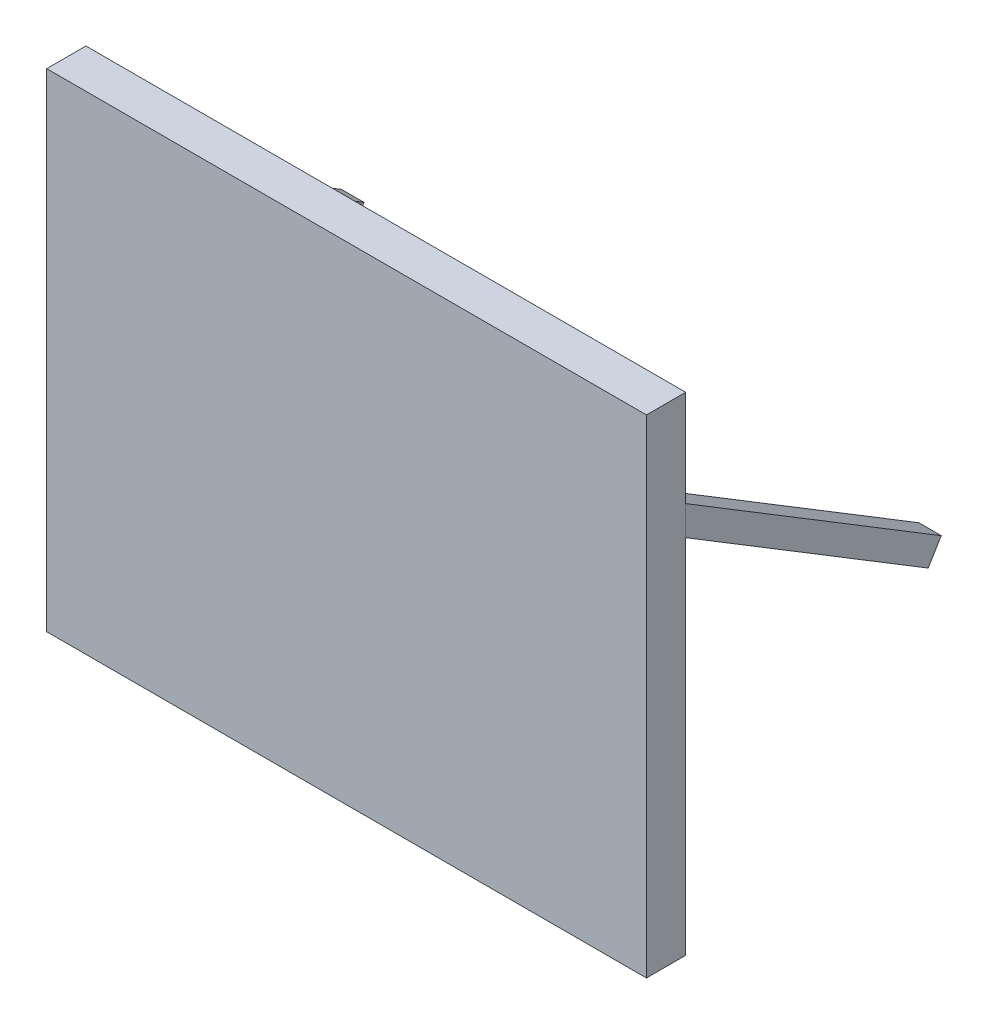
ISO-10303-21;
HEADER;
FILE_DESCRIPTION(('STEP AP214'),'2;1');
FILE_NAME('part.step','',(''),(''),'','','');
FILE_SCHEMA(('AUTOMOTIVE_DESIGN { 1 0 10303 214 1 1 1 1 }'));
ENDSEC;
DATA;
#1=APPLICATION_CONTEXT('core data for automotive mechanical design processes');
#2=APPLICATION_PROTOCOL_DEFINITION('international standard','automotive_design',2000,#1);
#3=PRODUCT_CONTEXT('',#1,'mechanical');
#4=PRODUCT('Part','Part','',(#3));
#5=PRODUCT_RELATED_PRODUCT_CATEGORY('part','',(#4));
#6=PRODUCT_DEFINITION_FORMATION('','',#4);
#7=PRODUCT_DEFINITION_CONTEXT('part definition',#1,'design');
#8=PRODUCT_DEFINITION('design','',#6,#7);
#9=PRODUCT_DEFINITION_SHAPE('','',#8);
#10=(LENGTH_UNIT() NAMED_UNIT(*) SI_UNIT(.MILLI.,.METRE.));
#11=(NAMED_UNIT(*) PLANE_ANGLE_UNIT() SI_UNIT($,.RADIAN.));
#12=(NAMED_UNIT(*) SI_UNIT($,.STERADIAN.) SOLID_ANGLE_UNIT());
#13=UNCERTAINTY_MEASURE_WITH_UNIT(LENGTH_MEASURE(1.E-05),#10,'distance_accuracy_value','');
#14=(GEOMETRIC_REPRESENTATION_CONTEXT(3) GLOBAL_UNCERTAINTY_ASSIGNED_CONTEXT((#13)) GLOBAL_UNIT_ASSIGNED_CONTEXT((#10,
#11,#12)) REPRESENTATION_CONTEXT('',''));
#15=CARTESIAN_POINT('',(0.,0.,0.));
#16=DIRECTION('',(0.,0.,1.));
#17=DIRECTION('',(1.,0.,0.));
#18=AXIS2_PLACEMENT_3D('',#15,#16,#17);
#19=CARTESIAN_POINT('',(314.325,133.566148273431,0.));
#20=DIRECTION('',(0.,0.,1.));
#21=DIRECTION('',(0.,-1.,0.));
#22=AXIS2_PLACEMENT_3D('',#19,#20,#21);
#23=PLANE('',#22);
#24=DIRECTION('',(0.,-1.,0.));
#25=VECTOR('',#24,1.);
#26=CARTESIAN_POINT('',(339.725,133.566148273431,0.));
#27=LINE('',#26,#25);
#28=CARTESIAN_POINT('',(339.725,166.995205225539,0.));
#29=VERTEX_POINT('',#28);
#30=CARTESIAN_POINT('',(339.725,133.566148273431,0.));
#31=VERTEX_POINT('',#30);
#32=EDGE_CURVE('E109',#29,#31,#27,.T.);
#33=ORIENTED_EDGE('',*,*,#32,.F.);
#34=DIRECTION('',(1.,0.,0.));
#35=VECTOR('',#34,1.);
#36=CARTESIAN_POINT('',(314.325,166.995205225539,0.));
#37=LINE('',#36,#35);
#38=CARTESIAN_POINT('',(314.325,166.995205225539,0.));
#39=VERTEX_POINT('',#38);
#40=EDGE_CURVE('E12',#39,#29,#37,.T.);
#41=ORIENTED_EDGE('',*,*,#40,.F.);
#42=DIRECTION('',(0.,-1.,0.));
#43=VECTOR('',#42,1.);
#44=CARTESIAN_POINT('',(314.325,133.566148273431,0.));
#45=LINE('',#44,#43);
#46=CARTESIAN_POINT('',(314.325,133.566148273431,0.));
#47=VERTEX_POINT('',#46);
#48=EDGE_CURVE('E103',#39,#47,#45,.T.);
#49=ORIENTED_EDGE('',*,*,#48,.T.);
#50=DIRECTION('',(1.,0.,0.));
#51=VECTOR('',#50,1.);
#52=CARTESIAN_POINT('',(314.325,133.566148273431,0.));
#53=LINE('',#52,#51);
#54=EDGE_CURVE('E48',#47,#31,#53,.T.);
#55=ORIENTED_EDGE('',*,*,#54,.T.);
#56=EDGE_LOOP('',(#33,#41,#49,#55));
#57=FACE_BOUND('',#56,.T.);
#58=ADVANCED_FACE('F45',(#57),#23,.T.);
#59=CARTESIAN_POINT('',(314.325,166.995205225539,0.));
#60=DIRECTION('',(0.,0.854215947005178,-0.519918374249311));
#61=DIRECTION('',(0.,0.519918374249311,0.854215947005178));
#62=AXIS2_PLACEMENT_3D('',#59,#60,#61);
#63=PLANE('',#62);
#64=DIRECTION('',(0.,0.519918374249311,0.854215947005178));
#65=VECTOR('',#64,1.);
#66=CARTESIAN_POINT('',(339.725,166.995205225539,0.));
#67=LINE('',#66,#65);
#68=CARTESIAN_POINT('',(339.725,-9.2494826660646,-289.566652052512));
#69=VERTEX_POINT('',#68);
#70=EDGE_CURVE('E105',#69,#29,#67,.T.);
#71=ORIENTED_EDGE('',*,*,#70,.F.);
#72=DIRECTION('',(1.,0.,0.));
#73=VECTOR('',#72,1.);
#74=CARTESIAN_POINT('',(314.325,-9.2494826660646,-289.566652052512));
#75=LINE('',#74,#73);
#76=CARTESIAN_POINT('',(314.325,-9.2494826660646,-289.566652052512));
#77=VERTEX_POINT('',#76);
#78=EDGE_CURVE('E54',#77,#69,#75,.T.);
#79=ORIENTED_EDGE('',*,*,#78,.F.);
#80=DIRECTION('',(0.,0.519918374249311,0.854215947005178));
#81=VECTOR('',#80,1.);
#82=CARTESIAN_POINT('',(314.325,166.995205225539,0.));
#83=LINE('',#82,#81);
#84=EDGE_CURVE('E100',#77,#39,#83,.T.);
#85=ORIENTED_EDGE('',*,*,#84,.T.);
#86=ORIENTED_EDGE('',*,*,#40,.T.);
#87=EDGE_LOOP('',(#71,#79,#85,#86));
#88=FACE_BOUND('',#87,.T.);
#89=ADVANCED_FACE('F119',(#88),#63,.T.);
#90=CARTESIAN_POINT('',(314.325,-9.2494826660646,-289.566652052512));
#91=DIRECTION('',(0.,-0.519918374249312,-0.854215947005178));
#92=DIRECTION('',(0.,0.854215947005178,-0.519918374249312));
#93=AXIS2_PLACEMENT_3D('',#90,#91,#92);
#94=PLANE('',#93);
#95=DIRECTION('',(0.,0.854215947005178,-0.519918374249312));
#96=VECTOR('',#95,1.);
#97=CARTESIAN_POINT('',(339.725,-9.2494826660646,-289.566652052512));
#98=LINE('',#97,#96);
#99=CARTESIAN_POINT('',(339.725,-33.642160214336,-274.720053485782));
#100=VERTEX_POINT('',#99);
#101=EDGE_CURVE('E95',#100,#69,#98,.T.);
#102=ORIENTED_EDGE('',*,*,#101,.F.);
#103=DIRECTION('',(1.,0.,0.));
#104=VECTOR('',#103,1.);
#105=CARTESIAN_POINT('',(314.325,-33.642160214336,-274.720053485782));
#106=LINE('',#105,#104);
#107=CARTESIAN_POINT('',(314.325,-33.642160214336,-274.720053485782));
#108=VERTEX_POINT('',#107);
#109=EDGE_CURVE('E90',#108,#100,#106,.T.);
#110=ORIENTED_EDGE('',*,*,#109,.F.);
#111=DIRECTION('',(0.,0.854215947005178,-0.519918374249312));
#112=VECTOR('',#111,1.);
#113=CARTESIAN_POINT('',(314.325,-9.2494826660646,-289.566652052512));
#114=LINE('',#113,#112);
#115=EDGE_CURVE('E93',#108,#77,#114,.T.);
#116=ORIENTED_EDGE('',*,*,#115,.T.);
#117=ORIENTED_EDGE('',*,*,#78,.T.);
#118=EDGE_LOOP('',(#102,#110,#116,#117));
#119=FACE_BOUND('',#118,.T.);
#120=ADVANCED_FACE('F92',(#119),#94,.T.);
#121=CARTESIAN_POINT('',(314.325,-33.642160214336,-274.720053485782));
#122=DIRECTION('',(0.,-0.854215947005178,0.519918374249312));
#123=DIRECTION('',(0.,-0.519918374249312,-0.854215947005178));
#124=AXIS2_PLACEMENT_3D('',#121,#122,#123);
#125=PLANE('',#124);
#126=DIRECTION('',(0.,-0.519918374249312,-0.854215947005178));
#127=VECTOR('',#126,1.);
#128=CARTESIAN_POINT('',(339.725,-33.642160214336,-274.720053485782));
#129=LINE('',#128,#127);
#130=EDGE_CURVE('E112',#31,#100,#129,.T.);
#131=ORIENTED_EDGE('',*,*,#130,.F.);
#132=ORIENTED_EDGE('',*,*,#54,.F.);
#133=DIRECTION('',(0.,-0.519918374249312,-0.854215947005178));
#134=VECTOR('',#133,1.);
#135=CARTESIAN_POINT('',(314.325,-33.642160214336,-274.720053485782));
#136=LINE('',#135,#134);
#137=EDGE_CURVE('E99',#47,#108,#136,.T.);
#138=ORIENTED_EDGE('',*,*,#137,.T.);
#139=ORIENTED_EDGE('',*,*,#109,.T.);
#140=EDGE_LOOP('',(#131,#132,#138,#139));
#141=FACE_BOUND('',#140,.T.);
#142=ADVANCED_FACE('F102',(#141),#125,.T.);
#143=CARTESIAN_POINT('',(314.325,0.,0.));
#144=DIRECTION('',(-1.,0.,0.));
#145=DIRECTION('',(0.,0.,1.));
#146=AXIS2_PLACEMENT_3D('',#143,#144,#145);
#147=PLANE('',#146);
#148=ORIENTED_EDGE('',*,*,#48,.F.);
#149=ORIENTED_EDGE('',*,*,#84,.F.);
#150=ORIENTED_EDGE('',*,*,#115,.F.);
#151=ORIENTED_EDGE('',*,*,#137,.F.);
#152=EDGE_LOOP('',(#148,#149,#150,#151));
#153=FACE_BOUND('',#152,.T.);
#154=ADVANCED_FACE('F98',(#153),#147,.T.);
#155=CARTESIAN_POINT('',(339.725,0.,0.));
#156=DIRECTION('',(-1.,0.,0.));
#157=DIRECTION('',(0.,0.,1.));
#158=AXIS2_PLACEMENT_3D('',#155,#156,#157);
#159=PLANE('',#158);
#160=ORIENTED_EDGE('',*,*,#32,.T.);
#161=ORIENTED_EDGE('',*,*,#130,.T.);
#162=ORIENTED_EDGE('',*,*,#101,.T.);
#163=ORIENTED_EDGE('',*,*,#70,.T.);
#164=EDGE_LOOP('',(#160,#161,#162,#163));
#165=FACE_BOUND('',#164,.T.);
#166=ADVANCED_FACE('F118',(#165),#159,.F.);
#167=CLOSED_SHELL('',(#58,#89,#120,#142,#154,#166));
#168=MANIFOLD_SOLID_BREP('B2',#167);
#169=CARTESIAN_POINT('',(0.,0.,0.));
#170=DIRECTION('',(0.,0.,1.));
#171=DIRECTION('',(1.,0.,0.));
#172=AXIS2_PLACEMENT_3D('',#169,#170,#171);
#173=PLANE('',#172);
#174=DIRECTION('',(-1.,0.,0.));
#175=VECTOR('',#174,1.);
#176=CARTESIAN_POINT('',(-314.325,133.566148273431,0.));
#177=LINE('',#176,#175);
#178=CARTESIAN_POINT('',(-314.325,133.566148273431,0.));
#179=VERTEX_POINT('',#178);
#180=CARTESIAN_POINT('',(-339.725,133.566148273431,0.));
#181=VERTEX_POINT('',#180);
#182=EDGE_CURVE('E260',#179,#181,#177,.T.);
#183=ORIENTED_EDGE('',*,*,#182,.F.);
#184=DIRECTION('',(0.,-1.,0.));
#185=VECTOR('',#184,1.);
#186=CARTESIAN_POINT('',(-314.325,-276.225,0.));
#187=LINE('',#186,#185);
#188=CARTESIAN_POINT('',(-314.325,166.995205225539,0.));
#189=VERTEX_POINT('',#188);
#190=EDGE_CURVE('E247',#189,#179,#187,.T.);
#191=ORIENTED_EDGE('',*,*,#190,.F.);
#192=DIRECTION('',(-1.,0.,0.));
#193=VECTOR('',#192,1.);
#194=CARTESIAN_POINT('',(-314.325,166.995205225539,0.));
#195=LINE('',#194,#193);
#196=CARTESIAN_POINT('',(-339.725,166.995205225539,0.));
#197=VERTEX_POINT('',#196);
#198=EDGE_CURVE('E254',#189,#197,#195,.T.);
#199=ORIENTED_EDGE('',*,*,#198,.T.);
#200=DIRECTION('',(0.,-1.,0.));
#201=VECTOR('',#200,1.);
#202=CARTESIAN_POINT('',(-339.725,-276.225,0.));
#203=LINE('',#202,#201);
#204=CARTESIAN_POINT('',(-339.725,276.225,0.));
#205=VERTEX_POINT('',#204);
#206=EDGE_CURVE('E286',#205,#197,#203,.T.);
#207=ORIENTED_EDGE('',*,*,#206,.F.);
#208=DIRECTION('',(-1.,0.,0.));
#209=VECTOR('',#208,1.);
#210=CARTESIAN_POINT('',(339.725,276.225,0.));
#211=LINE('',#210,#209);
#212=CARTESIAN_POINT('',(339.725,276.225,0.));
#213=VERTEX_POINT('',#212);
#214=EDGE_CURVE('E214',#213,#205,#211,.T.);
#215=ORIENTED_EDGE('',*,*,#214,.F.);
#216=DIRECTION('',(0.,1.,0.));
#217=VECTOR('',#216,1.);
#218=CARTESIAN_POINT('',(339.725,-276.225,0.));
#219=LINE('',#218,#217);
#220=CARTESIAN_POINT('',(339.725,-276.225,0.));
#221=VERTEX_POINT('',#220);
#222=EDGE_CURVE('E290',#221,#213,#219,.T.);
#223=ORIENTED_EDGE('',*,*,#222,.F.);
#224=DIRECTION('',(1.,0.,0.));
#225=VECTOR('',#224,1.);
#226=CARTESIAN_POINT('',(339.725,-276.225,0.));
#227=LINE('',#226,#225);
#228=CARTESIAN_POINT('',(-339.725,-276.225,0.));
#229=VERTEX_POINT('',#228);
#230=EDGE_CURVE('E288',#229,#221,#227,.T.);
#231=ORIENTED_EDGE('',*,*,#230,.F.);
#232=EDGE_CURVE('E259',#181,#229,#203,.T.);
#233=ORIENTED_EDGE('',*,*,#232,.F.);
#234=EDGE_LOOP('',(#183,#191,#199,#207,#215,#223,#231,#233));
#235=FACE_BOUND('',#234,.T.);
#236=ADVANCED_FACE('F169',(#235),#173,.F.);
#237=CARTESIAN_POINT('',(-339.725,-276.225,44.45));
#238=DIRECTION('',(1.,0.,0.));
#239=DIRECTION('',(0.,0.,-1.));
#240=AXIS2_PLACEMENT_3D('',#237,#238,#239);
#241=PLANE('',#240);
#242=ORIENTED_EDGE('',*,*,#206,.T.);
#243=DIRECTION('',(0.,0.519918374249311,0.854215947005178));
#244=VECTOR('',#243,1.);
#245=CARTESIAN_POINT('',(-339.725,66.9273321663137,-164.409601937036));
#246=LINE('',#245,#244);
#247=CARTESIAN_POINT('',(-339.725,-9.24948266606451,-289.566652052512));
#248=VERTEX_POINT('',#247);
#249=EDGE_CURVE('E184',#248,#197,#246,.T.);
#250=ORIENTED_EDGE('',*,*,#249,.F.);
#251=DIRECTION('',(0.,0.854215947005178,-0.519918374249312));
#252=VECTOR('',#251,1.);
#253=CARTESIAN_POINT('',(-339.725,-352.401814832378,-80.7070501154764));
#254=LINE('',#253,#252);
#255=CARTESIAN_POINT('',(-339.725,-33.642160214336,-274.720053485782));
#256=VERTEX_POINT('',#255);
#257=EDGE_CURVE('E252',#256,#248,#254,.T.);
#258=ORIENTED_EDGE('',*,*,#257,.F.);
#259=DIRECTION('',(0.,-0.519918374249312,-0.854215947005178));
#260=VECTOR('',#259,1.);
#261=CARTESIAN_POINT('',(-339.725,42.5346546180422,-149.563003370306));
#262=LINE('',#261,#260);
#263=EDGE_CURVE('E271',#181,#256,#262,.T.);
#264=ORIENTED_EDGE('',*,*,#263,.F.);
#265=ORIENTED_EDGE('',*,*,#232,.T.);
#266=DIRECTION('',(0.,0.,-1.));
#267=VECTOR('',#266,1.);
#268=CARTESIAN_POINT('',(-339.725,-276.225,44.45));
#269=LINE('',#268,#267);
#270=CARTESIAN_POINT('',(-339.725,-276.225,44.45));
#271=VERTEX_POINT('',#270);
#272=EDGE_CURVE('E43',#271,#229,#269,.T.);
#273=ORIENTED_EDGE('',*,*,#272,.F.);
#274=DIRECTION('',(0.,-1.,0.));
#275=VECTOR('',#274,1.);
#276=CARTESIAN_POINT('',(-339.725,-276.225,44.45));
#277=LINE('',#276,#275);
#278=CARTESIAN_POINT('',(-339.725,276.225,44.45));
#279=VERTEX_POINT('',#278);
#280=EDGE_CURVE('E279',#279,#271,#277,.T.);
#281=ORIENTED_EDGE('',*,*,#280,.F.);
#282=DIRECTION('',(0.,0.,-1.));
#283=VECTOR('',#282,1.);
#284=CARTESIAN_POINT('',(-339.725,276.225,44.45));
#285=LINE('',#284,#283);
#286=EDGE_CURVE('E285',#279,#205,#285,.T.);
#287=ORIENTED_EDGE('',*,*,#286,.T.);
#288=EDGE_LOOP('',(#242,#250,#258,#264,#265,#273,#281,#287));
#289=FACE_BOUND('',#288,.T.);
#290=ADVANCED_FACE('F171',(#289),#241,.F.);
#291=CARTESIAN_POINT('',(339.725,-276.225,44.45));
#292=DIRECTION('',(0.,1.,0.));
#293=DIRECTION('',(-1.,0.,0.));
#294=AXIS2_PLACEMENT_3D('',#291,#292,#293);
#295=PLANE('',#294);
#296=ORIENTED_EDGE('',*,*,#230,.T.);
#297=DIRECTION('',(0.,0.,-1.));
#298=VECTOR('',#297,1.);
#299=CARTESIAN_POINT('',(339.725,-276.225,44.45));
#300=LINE('',#299,#298);
#301=CARTESIAN_POINT('',(339.725,-276.225,44.45));
#302=VERTEX_POINT('',#301);
#303=EDGE_CURVE('E177',#302,#221,#300,.T.);
#304=ORIENTED_EDGE('',*,*,#303,.F.);
#305=DIRECTION('',(1.,0.,0.));
#306=VECTOR('',#305,1.);
#307=CARTESIAN_POINT('',(339.725,-276.225,44.45));
#308=LINE('',#307,#306);
#309=EDGE_CURVE('E221',#271,#302,#308,.T.);
#310=ORIENTED_EDGE('',*,*,#309,.F.);
#311=ORIENTED_EDGE('',*,*,#272,.T.);
#312=EDGE_LOOP('',(#296,#304,#310,#311));
#313=FACE_BOUND('',#312,.T.);
#314=ADVANCED_FACE('F315',(#313),#295,.F.);
#315=CARTESIAN_POINT('',(339.725,-276.225,44.45));
#316=DIRECTION('',(-1.,0.,0.));
#317=DIRECTION('',(0.,-1.,0.));
#318=AXIS2_PLACEMENT_3D('',#315,#316,#317);
#319=PLANE('',#318);
#320=ORIENTED_EDGE('',*,*,#222,.T.);
#321=DIRECTION('',(0.,0.,-1.));
#322=VECTOR('',#321,1.);
#323=CARTESIAN_POINT('',(339.725,276.225,44.45));
#324=LINE('',#323,#322);
#325=CARTESIAN_POINT('',(339.725,276.225,44.45));
#326=VERTEX_POINT('',#325);
#327=EDGE_CURVE('E294',#326,#213,#324,.T.);
#328=ORIENTED_EDGE('',*,*,#327,.F.);
#329=DIRECTION('',(0.,1.,0.));
#330=VECTOR('',#329,1.);
#331=CARTESIAN_POINT('',(339.725,-276.225,44.45));
#332=LINE('',#331,#330);
#333=EDGE_CURVE('E282',#302,#326,#332,.T.);
#334=ORIENTED_EDGE('',*,*,#333,.F.);
#335=ORIENTED_EDGE('',*,*,#303,.T.);
#336=EDGE_LOOP('',(#320,#328,#334,#335));
#337=FACE_BOUND('',#336,.T.);
#338=ADVANCED_FACE('F299',(#337),#319,.F.);
#339=CARTESIAN_POINT('',(339.725,276.225,44.45));
#340=DIRECTION('',(0.,-1.,0.));
#341=DIRECTION('',(1.,0.,0.));
#342=AXIS2_PLACEMENT_3D('',#339,#340,#341);
#343=PLANE('',#342);
#344=ORIENTED_EDGE('',*,*,#214,.T.);
#345=ORIENTED_EDGE('',*,*,#286,.F.);
#346=DIRECTION('',(-1.,0.,0.));
#347=VECTOR('',#346,1.);
#348=CARTESIAN_POINT('',(339.725,276.225,44.45));
#349=LINE('',#348,#347);
#350=EDGE_CURVE('E193',#326,#279,#349,.T.);
#351=ORIENTED_EDGE('',*,*,#350,.F.);
#352=ORIENTED_EDGE('',*,*,#327,.T.);
#353=EDGE_LOOP('',(#344,#345,#351,#352));
#354=FACE_BOUND('',#353,.T.);
#355=ADVANCED_FACE('F306',(#354),#343,.F.);
#356=CARTESIAN_POINT('',(0.,0.,44.45));
#357=DIRECTION('',(0.,0.,1.));
#358=DIRECTION('',(1.,0.,0.));
#359=AXIS2_PLACEMENT_3D('',#356,#357,#358);
#360=PLANE('',#359);
#361=ORIENTED_EDGE('',*,*,#280,.T.);
#362=ORIENTED_EDGE('',*,*,#309,.T.);
#363=ORIENTED_EDGE('',*,*,#333,.T.);
#364=ORIENTED_EDGE('',*,*,#350,.T.);
#365=EDGE_LOOP('',(#361,#362,#363,#364));
#366=FACE_BOUND('',#365,.T.);
#367=ADVANCED_FACE('F308',(#366),#360,.T.);
#368=CARTESIAN_POINT('',(-314.325,66.9273321663137,-164.409601937036));
#369=DIRECTION('',(0.,-0.854215947005178,0.519918374249311));
#370=DIRECTION('',(0.,-0.519918374249311,-0.854215947005178));
#371=AXIS2_PLACEMENT_3D('',#368,#369,#370);
#372=PLANE('',#371);
#373=ORIENTED_EDGE('',*,*,#249,.T.);
#374=ORIENTED_EDGE('',*,*,#198,.F.);
#375=DIRECTION('',(0.,0.519918374249311,0.854215947005178));
#376=VECTOR('',#375,1.);
#377=CARTESIAN_POINT('',(-314.325,66.9273321663137,-164.409601937036));
#378=LINE('',#377,#376);
#379=CARTESIAN_POINT('',(-314.325,-9.24948266606451,-289.566652052512));
#380=VERTEX_POINT('',#379);
#381=EDGE_CURVE('E244',#380,#189,#378,.T.);
#382=ORIENTED_EDGE('',*,*,#381,.F.);
#383=DIRECTION('',(-1.,0.,0.));
#384=VECTOR('',#383,1.);
#385=CARTESIAN_POINT('',(-314.325,-9.24948266606451,-289.566652052512));
#386=LINE('',#385,#384);
#387=EDGE_CURVE('E269',#380,#248,#386,.T.);
#388=ORIENTED_EDGE('',*,*,#387,.T.);
#389=EDGE_LOOP('',(#373,#374,#382,#388));
#390=FACE_BOUND('',#389,.T.);
#391=ADVANCED_FACE('F255',(#390),#372,.F.);
#392=CARTESIAN_POINT('',(-314.325,42.5346546180422,-149.563003370306));
#393=DIRECTION('',(0.,0.854215947005178,-0.519918374249312));
#394=DIRECTION('',(0.,0.519918374249312,0.854215947005178));
#395=AXIS2_PLACEMENT_3D('',#392,#393,#394);
#396=PLANE('',#395);
#397=ORIENTED_EDGE('',*,*,#263,.T.);
#398=DIRECTION('',(-1.,0.,0.));
#399=VECTOR('',#398,1.);
#400=CARTESIAN_POINT('',(-314.325,-33.642160214336,-274.720053485782));
#401=LINE('',#400,#399);
#402=CARTESIAN_POINT('',(-314.325,-33.642160214336,-274.720053485782));
#403=VERTEX_POINT('',#402);
#404=EDGE_CURVE('E275',#403,#256,#401,.T.);
#405=ORIENTED_EDGE('',*,*,#404,.F.);
#406=DIRECTION('',(0.,-0.519918374249312,-0.854215947005178));
#407=VECTOR('',#406,1.);
#408=CARTESIAN_POINT('',(-314.325,42.5346546180422,-149.563003370306));
#409=LINE('',#408,#407);
#410=EDGE_CURVE('E264',#179,#403,#409,.T.);
#411=ORIENTED_EDGE('',*,*,#410,.F.);
#412=ORIENTED_EDGE('',*,*,#182,.T.);
#413=EDGE_LOOP('',(#397,#405,#411,#412));
#414=FACE_BOUND('',#413,.T.);
#415=ADVANCED_FACE('F325',(#414),#396,.F.);
#416=CARTESIAN_POINT('',(-314.325,-352.401814832378,-80.7070501154764));
#417=DIRECTION('',(0.,0.519918374249312,0.854215947005178));
#418=DIRECTION('',(0.,-0.854215947005178,0.519918374249312));
#419=AXIS2_PLACEMENT_3D('',#416,#417,#418);
#420=PLANE('',#419);
#421=ORIENTED_EDGE('',*,*,#257,.T.);
#422=ORIENTED_EDGE('',*,*,#387,.F.);
#423=DIRECTION('',(0.,0.854215947005178,-0.519918374249312));
#424=VECTOR('',#423,1.);
#425=CARTESIAN_POINT('',(-314.325,-352.401814832378,-80.7070501154764));
#426=LINE('',#425,#424);
#427=EDGE_CURVE('E250',#403,#380,#426,.T.);
#428=ORIENTED_EDGE('',*,*,#427,.F.);
#429=ORIENTED_EDGE('',*,*,#404,.T.);
#430=EDGE_LOOP('',(#421,#422,#428,#429));
#431=FACE_BOUND('',#430,.T.);
#432=ADVANCED_FACE('F328',(#431),#420,.F.);
#433=CARTESIAN_POINT('',(-314.325,0.,0.));
#434=DIRECTION('',(-1.,0.,0.));
#435=DIRECTION('',(0.,0.,1.));
#436=AXIS2_PLACEMENT_3D('',#433,#434,#435);
#437=PLANE('',#436);
#438=ORIENTED_EDGE('',*,*,#381,.T.);
#439=ORIENTED_EDGE('',*,*,#190,.T.);
#440=ORIENTED_EDGE('',*,*,#410,.T.);
#441=ORIENTED_EDGE('',*,*,#427,.T.);
#442=EDGE_LOOP('',(#438,#439,#440,#441));
#443=FACE_BOUND('',#442,.T.);
#444=ADVANCED_FACE('F245',(#443),#437,.F.);
#445=CLOSED_SHELL('',(#236,#290,#314,#338,#355,#367,#391,#415,#432,#444));
#446=MANIFOLD_SOLID_BREP('B6',#445);
#447=ADVANCED_BREP_SHAPE_REPRESENTATION('',(#18,#168,#446),#14);
#448=SHAPE_DEFINITION_REPRESENTATION(#9,#447);
ENDSEC;
END-ISO-10303-21;
